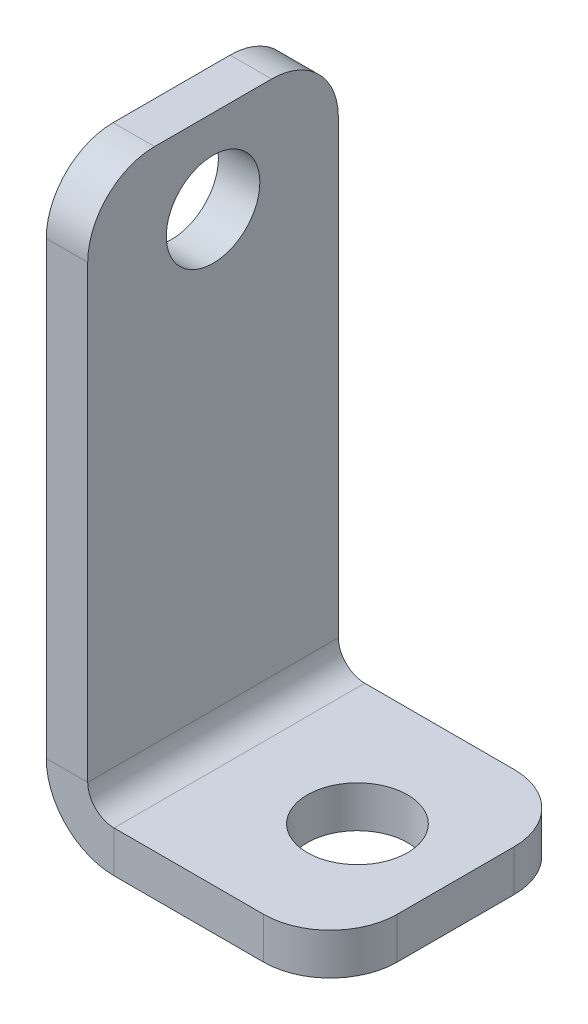
ISO-10303-21;
HEADER;
FILE_DESCRIPTION(('STEP AP214'),'2;1');
FILE_NAME('part.step','',(''),(''),'','','');
FILE_SCHEMA(('AUTOMOTIVE_DESIGN { 1 0 10303 214 1 1 1 1 }'));
ENDSEC;
DATA;
#1=APPLICATION_CONTEXT('core data for automotive mechanical design processes');
#2=APPLICATION_PROTOCOL_DEFINITION('international standard','automotive_design',2000,#1);
#3=PRODUCT_CONTEXT('',#1,'mechanical');
#4=PRODUCT('Part','Part','',(#3));
#5=PRODUCT_RELATED_PRODUCT_CATEGORY('part','',(#4));
#6=PRODUCT_DEFINITION_FORMATION('','',#4);
#7=PRODUCT_DEFINITION_CONTEXT('part definition',#1,'design');
#8=PRODUCT_DEFINITION('design','',#6,#7);
#9=PRODUCT_DEFINITION_SHAPE('','',#8);
#10=(LENGTH_UNIT() NAMED_UNIT(*) SI_UNIT(.MILLI.,.METRE.));
#11=(NAMED_UNIT(*) PLANE_ANGLE_UNIT() SI_UNIT($,.RADIAN.));
#12=(NAMED_UNIT(*) SI_UNIT($,.STERADIAN.) SOLID_ANGLE_UNIT());
#13=UNCERTAINTY_MEASURE_WITH_UNIT(LENGTH_MEASURE(1.E-05),#10,'distance_accuracy_value','');
#14=(GEOMETRIC_REPRESENTATION_CONTEXT(3) GLOBAL_UNCERTAINTY_ASSIGNED_CONTEXT((#13)) GLOBAL_UNIT_ASSIGNED_CONTEXT((#10,
#11,#12)) REPRESENTATION_CONTEXT('',''));
#15=CARTESIAN_POINT('',(0.,0.,0.));
#16=DIRECTION('',(0.,0.,1.));
#17=DIRECTION('',(1.,0.,0.));
#18=AXIS2_PLACEMENT_3D('',#15,#16,#17);
#19=CARTESIAN_POINT('',(0.,2.5748,9.525));
#20=DIRECTION('',(0.,0.,1.));
#21=DIRECTION('',(1.,0.,0.));
#22=AXIS2_PLACEMENT_3D('',#19,#20,#21);
#23=PLANE('',#22);
#24=DIRECTION('',(1.,0.,0.));
#25=VECTOR('',#24,1.);
#26=CARTESIAN_POINT('',(0.,2.5748,9.525));
#27=LINE('',#26,#25);
#28=CARTESIAN_POINT('',(0.,2.5748,9.525));
#29=VERTEX_POINT('',#28);
#30=CARTESIAN_POINT('',(1.5748,2.5748,9.525));
#31=VERTEX_POINT('',#30);
#32=EDGE_CURVE('E125',#29,#31,#27,.T.);
#33=ORIENTED_EDGE('',*,*,#32,.F.);
#34=CARTESIAN_POINT('',(2.5748,2.5748,9.525));
#35=DIRECTION('',(0.,0.,1.));
#36=DIRECTION('',(1.,0.,0.));
#37=AXIS2_PLACEMENT_3D('',#34,#35,#36);
#38=CIRCLE('',#37,2.5748);
#39=CARTESIAN_POINT('',(2.5748,0.,9.525));
#40=VERTEX_POINT('',#39);
#41=EDGE_CURVE('E129',#40,#29,#38,.F.);
#42=ORIENTED_EDGE('',*,*,#41,.F.);
#43=DIRECTION('',(0.,-1.,0.));
#44=VECTOR('',#43,1.);
#45=CARTESIAN_POINT('',(2.5748,1.5748,9.525));
#46=LINE('',#45,#44);
#47=CARTESIAN_POINT('',(2.5748,1.5748,9.525));
#48=VERTEX_POINT('',#47);
#49=EDGE_CURVE('E134',#48,#40,#46,.T.);
#50=ORIENTED_EDGE('',*,*,#49,.F.);
#51=CARTESIAN_POINT('',(2.5748,2.5748,9.525));
#52=DIRECTION('',(0.,0.,1.));
#53=DIRECTION('',(1.,0.,0.));
#54=AXIS2_PLACEMENT_3D('',#51,#52,#53);
#55=CIRCLE('',#54,1.);
#56=EDGE_CURVE('E131',#48,#31,#55,.F.);
#57=ORIENTED_EDGE('',*,*,#56,.T.);
#58=EDGE_LOOP('',(#33,#42,#50,#57));
#59=FACE_BOUND('',#58,.T.);
#60=ADVANCED_FACE('F34',(#59),#23,.T.);
#61=CARTESIAN_POINT('',(2.5748,1.5748,9.525));
#62=DIRECTION('',(0.,0.,1.));
#63=DIRECTION('',(1.,0.,0.));
#64=AXIS2_PLACEMENT_3D('',#61,#62,#63);
#65=PLANE('',#64);
#66=DIRECTION('',(0.,1.,0.));
#67=VECTOR('',#66,1.);
#68=CARTESIAN_POINT('',(1.5748,0.,9.525));
#69=LINE('',#68,#67);
#70=CARTESIAN_POINT('',(1.5748,19.685,9.525));
#71=VERTEX_POINT('',#70);
#72=EDGE_CURVE('E152',#31,#71,#69,.T.);
#73=ORIENTED_EDGE('',*,*,#72,.T.);
#74=DIRECTION('',(1.,0.,0.));
#75=VECTOR('',#74,1.);
#76=CARTESIAN_POINT('',(2.5748,19.685,9.525));
#77=LINE('',#76,#75);
#78=CARTESIAN_POINT('',(0.,19.685,9.525));
#79=VERTEX_POINT('',#78);
#80=EDGE_CURVE('E11',#71,#79,#77,.F.);
#81=ORIENTED_EDGE('',*,*,#80,.T.);
#82=DIRECTION('',(0.,1.,0.));
#83=VECTOR('',#82,1.);
#84=CARTESIAN_POINT('',(0.,0.,9.525));
#85=LINE('',#84,#83);
#86=EDGE_CURVE('E141',#29,#79,#85,.T.);
#87=ORIENTED_EDGE('',*,*,#86,.F.);
#88=ORIENTED_EDGE('',*,*,#32,.T.);
#89=EDGE_LOOP('',(#73,#81,#87,#88));
#90=FACE_BOUND('',#89,.T.);
#91=ADVANCED_FACE('F151',(#90),#65,.T.);
#92=CARTESIAN_POINT('',(2.5748,0.,0.));
#93=DIRECTION('',(0.,0.,-1.));
#94=DIRECTION('',(-1.,0.,0.));
#95=AXIS2_PLACEMENT_3D('',#92,#93,#94);
#96=PLANE('',#95);
#97=DIRECTION('',(0.,1.,0.));
#98=VECTOR('',#97,1.);
#99=CARTESIAN_POINT('',(2.5748,0.,0.));
#100=LINE('',#99,#98);
#101=CARTESIAN_POINT('',(2.5748,0.,0.));
#102=VERTEX_POINT('',#101);
#103=CARTESIAN_POINT('',(2.5748,1.5748,0.));
#104=VERTEX_POINT('',#103);
#105=EDGE_CURVE('E197',#102,#104,#100,.T.);
#106=ORIENTED_EDGE('',*,*,#105,.F.);
#107=CARTESIAN_POINT('',(2.5748,2.5748,0.));
#108=DIRECTION('',(0.,0.,1.));
#109=DIRECTION('',(1.,0.,0.));
#110=AXIS2_PLACEMENT_3D('',#107,#108,#109);
#111=CIRCLE('',#110,2.5748);
#112=CARTESIAN_POINT('',(0.,2.5748,0.));
#113=VERTEX_POINT('',#112);
#114=EDGE_CURVE('E171',#102,#113,#111,.F.);
#115=ORIENTED_EDGE('',*,*,#114,.T.);
#116=DIRECTION('',(-1.,0.,0.));
#117=VECTOR('',#116,1.);
#118=CARTESIAN_POINT('',(1.5748,2.5748,0.));
#119=LINE('',#118,#117);
#120=CARTESIAN_POINT('',(1.5748,2.5748,0.));
#121=VERTEX_POINT('',#120);
#122=EDGE_CURVE('E195',#121,#113,#119,.T.);
#123=ORIENTED_EDGE('',*,*,#122,.F.);
#124=CARTESIAN_POINT('',(2.5748,2.5748,0.));
#125=DIRECTION('',(0.,0.,1.));
#126=DIRECTION('',(1.,0.,0.));
#127=AXIS2_PLACEMENT_3D('',#124,#125,#126);
#128=CIRCLE('',#127,1.);
#129=EDGE_CURVE('E177',#104,#121,#128,.F.);
#130=ORIENTED_EDGE('',*,*,#129,.F.);
#131=EDGE_LOOP('',(#106,#115,#123,#130));
#132=FACE_BOUND('',#131,.T.);
#133=ADVANCED_FACE('F275',(#132),#96,.T.);
#134=CARTESIAN_POINT('',(1.5748,2.5748,0.));
#135=DIRECTION('',(0.,0.,-1.));
#136=DIRECTION('',(-1.,0.,0.));
#137=AXIS2_PLACEMENT_3D('',#134,#135,#136);
#138=PLANE('',#137);
#139=DIRECTION('',(1.,0.,0.));
#140=VECTOR('',#139,1.);
#141=CARTESIAN_POINT('',(0.,1.5748,0.));
#142=LINE('',#141,#140);
#143=CARTESIAN_POINT('',(8.255,1.5748,0.));
#144=VERTEX_POINT('',#143);
#145=EDGE_CURVE('E175',#144,#104,#142,.F.);
#146=ORIENTED_EDGE('',*,*,#145,.F.);
#147=DIRECTION('',(0.,-1.,0.));
#148=VECTOR('',#147,1.);
#149=CARTESIAN_POINT('',(8.255,2.5748,0.));
#150=LINE('',#149,#148);
#151=CARTESIAN_POINT('',(8.255,0.,0.));
#152=VERTEX_POINT('',#151);
#153=EDGE_CURVE('E216',#144,#152,#150,.T.);
#154=ORIENTED_EDGE('',*,*,#153,.T.);
#155=DIRECTION('',(-1.,0.,0.));
#156=VECTOR('',#155,1.);
#157=CARTESIAN_POINT('',(0.,0.,0.));
#158=LINE('',#157,#156);
#159=EDGE_CURVE('E173',#152,#102,#158,.T.);
#160=ORIENTED_EDGE('',*,*,#159,.T.);
#161=ORIENTED_EDGE('',*,*,#105,.T.);
#162=EDGE_LOOP('',(#146,#154,#160,#161));
#163=FACE_BOUND('',#162,.T.);
#164=ADVANCED_FACE('F268',(#163),#138,.T.);
#165=CARTESIAN_POINT('',(1.5748,0.,9.525));
#166=DIRECTION('',(-1.,0.,0.));
#167=DIRECTION('',(0.,0.,1.));
#168=AXIS2_PLACEMENT_3D('',#165,#166,#167);
#169=PLANE('',#168);
#170=CARTESIAN_POINT('',(1.5748,19.05,4.7625));
#171=DIRECTION('',(1.,0.,0.));
#172=DIRECTION('',(0.,0.,-1.));
#173=AXIS2_PLACEMENT_3D('',#170,#171,#172);
#174=CIRCLE('',#173,1.778);
#175=CARTESIAN_POINT('',(1.5748,19.05,2.9845));
#176=VERTEX_POINT('',#175);
#177=EDGE_CURVE('E252',#176,#176,#174,.T.);
#178=ORIENTED_EDGE('',*,*,#177,.F.);
#179=EDGE_LOOP('',(#178));
#180=FACE_BOUND('',#179,.T.);
#181=DIRECTION('',(0.,1.,0.));
#182=VECTOR('',#181,1.);
#183=CARTESIAN_POINT('',(1.5748,0.,0.));
#184=LINE('',#183,#182);
#185=CARTESIAN_POINT('',(1.5748,19.685,0.));
#186=VERTEX_POINT('',#185);
#187=EDGE_CURVE('E166',#121,#186,#184,.T.);
#188=ORIENTED_EDGE('',*,*,#187,.T.);
#189=CARTESIAN_POINT('',(1.5748,19.685,2.54));
#190=DIRECTION('',(-1.,0.,0.));
#191=DIRECTION('',(0.,0.,1.));
#192=AXIS2_PLACEMENT_3D('',#189,#190,#191);
#193=CIRCLE('',#192,2.54);
#194=CARTESIAN_POINT('',(1.5748,22.225,2.54));
#195=VERTEX_POINT('',#194);
#196=EDGE_CURVE('E224',#186,#195,#193,.F.);
#197=ORIENTED_EDGE('',*,*,#196,.T.);
#198=DIRECTION('',(0.,0.,-1.));
#199=VECTOR('',#198,1.);
#200=CARTESIAN_POINT('',(1.5748,22.225,9.525));
#201=LINE('',#200,#199);
#202=CARTESIAN_POINT('',(1.5748,22.225,6.985));
#203=VERTEX_POINT('',#202);
#204=EDGE_CURVE('E193',#203,#195,#201,.T.);
#205=ORIENTED_EDGE('',*,*,#204,.F.);
#206=CARTESIAN_POINT('',(1.5748,19.685,6.985));
#207=DIRECTION('',(-1.,0.,0.));
#208=DIRECTION('',(0.,0.,1.));
#209=AXIS2_PLACEMENT_3D('',#206,#207,#208);
#210=CIRCLE('',#209,2.54);
#211=EDGE_CURVE('E222',#203,#71,#210,.F.);
#212=ORIENTED_EDGE('',*,*,#211,.T.);
#213=ORIENTED_EDGE('',*,*,#72,.F.);
#214=DIRECTION('',(0.,0.,-1.));
#215=VECTOR('',#214,1.);
#216=CARTESIAN_POINT('',(1.5748,2.5748,9.525));
#217=LINE('',#216,#215);
#218=EDGE_CURVE('E165',#31,#121,#217,.T.);
#219=ORIENTED_EDGE('',*,*,#218,.T.);
#220=EDGE_LOOP('',(#188,#197,#205,#212,#213,#219));
#221=FACE_BOUND('',#220,.T.);
#222=ADVANCED_FACE('F240',(#180,#221),#169,.F.);
#223=CARTESIAN_POINT('',(0.,22.225,9.525));
#224=DIRECTION('',(0.,1.,0.));
#225=DIRECTION('',(0.,0.,1.));
#226=AXIS2_PLACEMENT_3D('',#223,#224,#225);
#227=PLANE('',#226);
#228=ORIENTED_EDGE('',*,*,#204,.T.);
#229=DIRECTION('',(1.,0.,0.));
#230=VECTOR('',#229,1.);
#231=CARTESIAN_POINT('',(0.,22.225,2.54));
#232=LINE('',#231,#230);
#233=CARTESIAN_POINT('',(0.,22.225,2.54));
#234=VERTEX_POINT('',#233);
#235=EDGE_CURVE('E55',#195,#234,#232,.F.);
#236=ORIENTED_EDGE('',*,*,#235,.T.);
#237=DIRECTION('',(0.,0.,-1.));
#238=VECTOR('',#237,1.);
#239=CARTESIAN_POINT('',(0.,22.225,9.525));
#240=LINE('',#239,#238);
#241=CARTESIAN_POINT('',(0.,22.225,6.985));
#242=VERTEX_POINT('',#241);
#243=EDGE_CURVE('E148',#242,#234,#240,.T.);
#244=ORIENTED_EDGE('',*,*,#243,.F.);
#245=DIRECTION('',(1.,0.,0.));
#246=VECTOR('',#245,1.);
#247=CARTESIAN_POINT('',(0.,22.225,6.985));
#248=LINE('',#247,#246);
#249=EDGE_CURVE('E226',#242,#203,#248,.T.);
#250=ORIENTED_EDGE('',*,*,#249,.T.);
#251=EDGE_LOOP('',(#228,#236,#244,#250));
#252=FACE_BOUND('',#251,.T.);
#253=ADVANCED_FACE('F241',(#252),#227,.T.);
#254=CARTESIAN_POINT('',(0.,0.,9.525));
#255=DIRECTION('',(-1.,0.,0.));
#256=DIRECTION('',(0.,0.,1.));
#257=AXIS2_PLACEMENT_3D('',#254,#255,#256);
#258=PLANE('',#257);
#259=CARTESIAN_POINT('',(0.,19.05,4.7625));
#260=DIRECTION('',(1.,0.,0.));
#261=DIRECTION('',(0.,0.,-1.));
#262=AXIS2_PLACEMENT_3D('',#259,#260,#261);
#263=CIRCLE('',#262,1.778);
#264=CARTESIAN_POINT('',(0.,19.05,2.9845));
#265=VERTEX_POINT('',#264);
#266=EDGE_CURVE('E249',#265,#265,#263,.T.);
#267=ORIENTED_EDGE('',*,*,#266,.T.);
#268=EDGE_LOOP('',(#267));
#269=FACE_BOUND('',#268,.T.);
#270=ORIENTED_EDGE('',*,*,#243,.T.);
#271=CARTESIAN_POINT('',(0.,19.685,2.54));
#272=DIRECTION('',(-1.,0.,0.));
#273=DIRECTION('',(0.,0.,1.));
#274=AXIS2_PLACEMENT_3D('',#271,#272,#273);
#275=CIRCLE('',#274,2.54);
#276=CARTESIAN_POINT('',(0.,19.685,0.));
#277=VERTEX_POINT('',#276);
#278=EDGE_CURVE('E42',#234,#277,#275,.T.);
#279=ORIENTED_EDGE('',*,*,#278,.T.);
#280=DIRECTION('',(0.,1.,0.));
#281=VECTOR('',#280,1.);
#282=CARTESIAN_POINT('',(0.,0.,0.));
#283=LINE('',#282,#281);
#284=EDGE_CURVE('E144',#113,#277,#283,.T.);
#285=ORIENTED_EDGE('',*,*,#284,.F.);
#286=DIRECTION('',(0.,0.,-1.));
#287=VECTOR('',#286,1.);
#288=CARTESIAN_POINT('',(0.,2.5748,9.525));
#289=LINE('',#288,#287);
#290=EDGE_CURVE('E139',#29,#113,#289,.T.);
#291=ORIENTED_EDGE('',*,*,#290,.F.);
#292=ORIENTED_EDGE('',*,*,#86,.T.);
#293=CARTESIAN_POINT('',(0.,19.685,6.985));
#294=DIRECTION('',(-1.,0.,0.));
#295=DIRECTION('',(0.,0.,1.));
#296=AXIS2_PLACEMENT_3D('',#293,#294,#295);
#297=CIRCLE('',#296,2.54);
#298=EDGE_CURVE('E230',#79,#242,#297,.T.);
#299=ORIENTED_EDGE('',*,*,#298,.T.);
#300=EDGE_LOOP('',(#270,#279,#285,#291,#292,#299));
#301=FACE_BOUND('',#300,.T.);
#302=ADVANCED_FACE('F140',(#269,#301),#258,.T.);
#303=CARTESIAN_POINT('',(2.5748,2.5748,9.525));
#304=DIRECTION('',(0.,0.,-1.));
#305=DIRECTION('',(-1.,0.,0.));
#306=AXIS2_PLACEMENT_3D('',#303,#304,#305);
#307=CYLINDRICAL_SURFACE('',#306,2.5748);
#308=ORIENTED_EDGE('',*,*,#114,.F.);
#309=DIRECTION('',(0.,0.,-1.));
#310=VECTOR('',#309,1.);
#311=CARTESIAN_POINT('',(2.5748,0.,9.525));
#312=LINE('',#311,#310);
#313=EDGE_CURVE('E149',#40,#102,#312,.T.);
#314=ORIENTED_EDGE('',*,*,#313,.F.);
#315=ORIENTED_EDGE('',*,*,#41,.T.);
#316=ORIENTED_EDGE('',*,*,#290,.T.);
#317=EDGE_LOOP('',(#308,#314,#315,#316));
#318=FACE_BOUND('',#317,.T.);
#319=ADVANCED_FACE('F155',(#318),#307,.T.);
#320=CARTESIAN_POINT('',(0.,0.,9.525));
#321=DIRECTION('',(0.,-1.,0.));
#322=DIRECTION('',(0.,0.,-1.));
#323=AXIS2_PLACEMENT_3D('',#320,#321,#322);
#324=PLANE('',#323);
#325=CARTESIAN_POINT('',(7.0612,0.,4.7625));
#326=DIRECTION('',(0.,1.,0.));
#327=DIRECTION('',(0.,0.,1.));
#328=AXIS2_PLACEMENT_3D('',#325,#326,#327);
#329=CIRCLE('',#328,1.905);
#330=CARTESIAN_POINT('',(7.0612,0.,6.6675));
#331=VERTEX_POINT('',#330);
#332=EDGE_CURVE('E169',#331,#331,#329,.T.);
#333=ORIENTED_EDGE('',*,*,#332,.T.);
#334=EDGE_LOOP('',(#333));
#335=FACE_BOUND('',#334,.T.);
#336=DIRECTION('',(0.,0.,-1.));
#337=VECTOR('',#336,1.);
#338=CARTESIAN_POINT('',(10.795,0.,9.525));
#339=LINE('',#338,#337);
#340=CARTESIAN_POINT('',(10.795,0.,6.985));
#341=VERTEX_POINT('',#340);
#342=CARTESIAN_POINT('',(10.795,0.,2.54));
#343=VERTEX_POINT('',#342);
#344=EDGE_CURVE('E188',#341,#343,#339,.T.);
#345=ORIENTED_EDGE('',*,*,#344,.F.);
#346=CARTESIAN_POINT('',(8.255,0.,6.985));
#347=DIRECTION('',(0.,-1.,0.));
#348=DIRECTION('',(0.,0.,-1.));
#349=AXIS2_PLACEMENT_3D('',#346,#347,#348);
#350=CIRCLE('',#349,2.54);
#351=CARTESIAN_POINT('',(8.255,0.,9.525));
#352=VERTEX_POINT('',#351);
#353=EDGE_CURVE('E208',#341,#352,#350,.T.);
#354=ORIENTED_EDGE('',*,*,#353,.T.);
#355=DIRECTION('',(-1.,0.,0.));
#356=VECTOR('',#355,1.);
#357=CARTESIAN_POINT('',(0.,0.,9.525));
#358=LINE('',#357,#356);
#359=EDGE_CURVE('E157',#352,#40,#358,.T.);
#360=ORIENTED_EDGE('',*,*,#359,.T.);
#361=ORIENTED_EDGE('',*,*,#313,.T.);
#362=ORIENTED_EDGE('',*,*,#159,.F.);
#363=CARTESIAN_POINT('',(8.255,0.,2.54));
#364=DIRECTION('',(0.,-1.,0.));
#365=DIRECTION('',(0.,0.,-1.));
#366=AXIS2_PLACEMENT_3D('',#363,#364,#365);
#367=CIRCLE('',#366,2.54);
#368=EDGE_CURVE('E206',#152,#343,#367,.T.);
#369=ORIENTED_EDGE('',*,*,#368,.T.);
#370=EDGE_LOOP('',(#345,#354,#360,#361,#362,#369));
#371=FACE_BOUND('',#370,.T.);
#372=ADVANCED_FACE('F361',(#335,#371),#324,.T.);
#373=CARTESIAN_POINT('',(10.795,1.5748,9.525));
#374=DIRECTION('',(1.,0.,0.));
#375=DIRECTION('',(0.,0.,-1.));
#376=AXIS2_PLACEMENT_3D('',#373,#374,#375);
#377=PLANE('',#376);
#378=DIRECTION('',(0.,0.,-1.));
#379=VECTOR('',#378,1.);
#380=CARTESIAN_POINT('',(10.795,1.5748,9.525));
#381=LINE('',#380,#379);
#382=CARTESIAN_POINT('',(10.795,1.5748,6.985));
#383=VERTEX_POINT('',#382);
#384=CARTESIAN_POINT('',(10.795,1.5748,2.54));
#385=VERTEX_POINT('',#384);
#386=EDGE_CURVE('E185',#383,#385,#381,.T.);
#387=ORIENTED_EDGE('',*,*,#386,.F.);
#388=DIRECTION('',(0.,-1.,0.));
#389=VECTOR('',#388,1.);
#390=CARTESIAN_POINT('',(10.795,1.5748,6.985));
#391=LINE('',#390,#389);
#392=EDGE_CURVE('E203',#383,#341,#391,.T.);
#393=ORIENTED_EDGE('',*,*,#392,.T.);
#394=ORIENTED_EDGE('',*,*,#344,.T.);
#395=DIRECTION('',(0.,-1.,0.));
#396=VECTOR('',#395,1.);
#397=CARTESIAN_POINT('',(10.795,1.5748,2.54));
#398=LINE('',#397,#396);
#399=EDGE_CURVE('E133',#343,#385,#398,.F.);
#400=ORIENTED_EDGE('',*,*,#399,.T.);
#401=EDGE_LOOP('',(#387,#393,#394,#400));
#402=FACE_BOUND('',#401,.T.);
#403=ADVANCED_FACE('F350',(#402),#377,.T.);
#404=CARTESIAN_POINT('',(0.,1.5748,9.525));
#405=DIRECTION('',(0.,-1.,0.));
#406=DIRECTION('',(0.,0.,-1.));
#407=AXIS2_PLACEMENT_3D('',#404,#405,#406);
#408=PLANE('',#407);
#409=CARTESIAN_POINT('',(7.0612,1.5748,4.7625));
#410=DIRECTION('',(0.,1.,0.));
#411=DIRECTION('',(0.,0.,1.));
#412=AXIS2_PLACEMENT_3D('',#409,#410,#411);
#413=CIRCLE('',#412,1.905);
#414=CARTESIAN_POINT('',(7.0612,1.5748,6.6675));
#415=VERTEX_POINT('',#414);
#416=EDGE_CURVE('E246',#415,#415,#413,.T.);
#417=ORIENTED_EDGE('',*,*,#416,.F.);
#418=EDGE_LOOP('',(#417));
#419=FACE_BOUND('',#418,.T.);
#420=DIRECTION('',(1.,0.,0.));
#421=VECTOR('',#420,1.);
#422=CARTESIAN_POINT('',(0.,1.5748,9.525));
#423=LINE('',#422,#421);
#424=CARTESIAN_POINT('',(8.255,1.5748,9.525));
#425=VERTEX_POINT('',#424);
#426=EDGE_CURVE('E159',#425,#48,#423,.F.);
#427=ORIENTED_EDGE('',*,*,#426,.F.);
#428=CARTESIAN_POINT('',(8.255,1.5748,6.985));
#429=DIRECTION('',(0.,-1.,0.));
#430=DIRECTION('',(0.,0.,-1.));
#431=AXIS2_PLACEMENT_3D('',#428,#429,#430);
#432=CIRCLE('',#431,2.54);
#433=EDGE_CURVE('E214',#425,#383,#432,.F.);
#434=ORIENTED_EDGE('',*,*,#433,.T.);
#435=ORIENTED_EDGE('',*,*,#386,.T.);
#436=CARTESIAN_POINT('',(8.255,1.5748,2.54));
#437=DIRECTION('',(0.,-1.,0.));
#438=DIRECTION('',(0.,0.,-1.));
#439=AXIS2_PLACEMENT_3D('',#436,#437,#438);
#440=CIRCLE('',#439,2.54);
#441=EDGE_CURVE('E212',#385,#144,#440,.F.);
#442=ORIENTED_EDGE('',*,*,#441,.T.);
#443=ORIENTED_EDGE('',*,*,#145,.T.);
#444=DIRECTION('',(0.,0.,-1.));
#445=VECTOR('',#444,1.);
#446=CARTESIAN_POINT('',(2.5748,1.5748,9.525));
#447=LINE('',#446,#445);
#448=EDGE_CURVE('E182',#48,#104,#447,.T.);
#449=ORIENTED_EDGE('',*,*,#448,.F.);
#450=EDGE_LOOP('',(#427,#434,#435,#442,#443,#449));
#451=FACE_BOUND('',#450,.T.);
#452=ADVANCED_FACE('F345',(#419,#451),#408,.F.);
#453=CARTESIAN_POINT('',(2.5748,2.5748,9.525));
#454=DIRECTION('',(0.,0.,-1.));
#455=DIRECTION('',(-1.,0.,0.));
#456=AXIS2_PLACEMENT_3D('',#453,#454,#455);
#457=CYLINDRICAL_SURFACE('',#456,1.);
#458=ORIENTED_EDGE('',*,*,#129,.T.);
#459=ORIENTED_EDGE('',*,*,#218,.F.);
#460=ORIENTED_EDGE('',*,*,#56,.F.);
#461=ORIENTED_EDGE('',*,*,#448,.T.);
#462=EDGE_LOOP('',(#458,#459,#460,#461));
#463=FACE_BOUND('',#462,.T.);
#464=ADVANCED_FACE('F336',(#463),#457,.F.);
#465=CARTESIAN_POINT('',(2.5748,2.5748,9.525));
#466=DIRECTION('',(0.,0.,1.));
#467=DIRECTION('',(1.,0.,0.));
#468=AXIS2_PLACEMENT_3D('',#465,#466,#467);
#469=PLANE('',#468);
#470=ORIENTED_EDGE('',*,*,#359,.F.);
#471=DIRECTION('',(0.,-1.,0.));
#472=VECTOR('',#471,1.);
#473=CARTESIAN_POINT('',(8.255,2.5748,9.525));
#474=LINE('',#473,#472);
#475=EDGE_CURVE('E210',#352,#425,#474,.F.);
#476=ORIENTED_EDGE('',*,*,#475,.T.);
#477=ORIENTED_EDGE('',*,*,#426,.T.);
#478=ORIENTED_EDGE('',*,*,#49,.T.);
#479=EDGE_LOOP('',(#470,#476,#477,#478));
#480=FACE_BOUND('',#479,.T.);
#481=ADVANCED_FACE('F324',(#480),#469,.T.);
#482=CARTESIAN_POINT('',(2.5748,2.5748,0.));
#483=DIRECTION('',(0.,0.,1.));
#484=DIRECTION('',(1.,0.,0.));
#485=AXIS2_PLACEMENT_3D('',#482,#483,#484);
#486=PLANE('',#485);
#487=ORIENTED_EDGE('',*,*,#284,.T.);
#488=DIRECTION('',(1.,0.,0.));
#489=VECTOR('',#488,1.);
#490=CARTESIAN_POINT('',(1.5748,19.685,0.));
#491=LINE('',#490,#489);
#492=EDGE_CURVE('E219',#277,#186,#491,.T.);
#493=ORIENTED_EDGE('',*,*,#492,.T.);
#494=ORIENTED_EDGE('',*,*,#187,.F.);
#495=ORIENTED_EDGE('',*,*,#122,.T.);
#496=EDGE_LOOP('',(#487,#493,#494,#495));
#497=FACE_BOUND('',#496,.T.);
#498=ADVANCED_FACE('F235',(#497),#486,.F.);
#499=CARTESIAN_POINT('',(7.0612,0.,4.7625));
#500=DIRECTION('',(0.,1.,0.));
#501=DIRECTION('',(0.,0.,1.));
#502=AXIS2_PLACEMENT_3D('',#499,#500,#501);
#503=CYLINDRICAL_SURFACE('',#502,1.905);
#504=ORIENTED_EDGE('',*,*,#332,.F.);
#505=EDGE_LOOP('',(#504));
#506=FACE_BOUND('',#505,.T.);
#507=ORIENTED_EDGE('',*,*,#416,.T.);
#508=EDGE_LOOP('',(#507));
#509=FACE_BOUND('',#508,.T.);
#510=ADVANCED_FACE('F263',(#506,#509),#503,.F.);
#511=CARTESIAN_POINT('',(0.,19.05,4.7625));
#512=DIRECTION('',(1.,0.,0.));
#513=DIRECTION('',(0.,0.,-1.));
#514=AXIS2_PLACEMENT_3D('',#511,#512,#513);
#515=CYLINDRICAL_SURFACE('',#514,1.778);
#516=ORIENTED_EDGE('',*,*,#266,.F.);
#517=EDGE_LOOP('',(#516));
#518=FACE_BOUND('',#517,.T.);
#519=ORIENTED_EDGE('',*,*,#177,.T.);
#520=EDGE_LOOP('',(#519));
#521=FACE_BOUND('',#520,.T.);
#522=ADVANCED_FACE('F259',(#518,#521),#515,.F.);
#523=CARTESIAN_POINT('',(8.255,1.5748,6.985));
#524=DIRECTION('',(0.,-1.,0.));
#525=DIRECTION('',(0.,0.,-1.));
#526=AXIS2_PLACEMENT_3D('',#523,#524,#525);
#527=CYLINDRICAL_SURFACE('',#526,2.54);
#528=ORIENTED_EDGE('',*,*,#433,.F.);
#529=ORIENTED_EDGE('',*,*,#475,.F.);
#530=ORIENTED_EDGE('',*,*,#353,.F.);
#531=ORIENTED_EDGE('',*,*,#392,.F.);
#532=EDGE_LOOP('',(#528,#529,#530,#531));
#533=FACE_BOUND('',#532,.T.);
#534=ADVANCED_FACE('F262',(#533),#527,.T.);
#535=CARTESIAN_POINT('',(8.255,2.5748,2.54));
#536=DIRECTION('',(0.,-1.,0.));
#537=DIRECTION('',(0.,0.,-1.));
#538=AXIS2_PLACEMENT_3D('',#535,#536,#537);
#539=CYLINDRICAL_SURFACE('',#538,2.54);
#540=ORIENTED_EDGE('',*,*,#441,.F.);
#541=ORIENTED_EDGE('',*,*,#399,.F.);
#542=ORIENTED_EDGE('',*,*,#368,.F.);
#543=ORIENTED_EDGE('',*,*,#153,.F.);
#544=EDGE_LOOP('',(#540,#541,#542,#543));
#545=FACE_BOUND('',#544,.T.);
#546=ADVANCED_FACE('F288',(#545),#539,.T.);
#547=CARTESIAN_POINT('',(2.5748,19.685,2.54));
#548=DIRECTION('',(-1.,0.,0.));
#549=DIRECTION('',(0.,0.,1.));
#550=AXIS2_PLACEMENT_3D('',#547,#548,#549);
#551=CYLINDRICAL_SURFACE('',#550,2.54);
#552=ORIENTED_EDGE('',*,*,#278,.F.);
#553=ORIENTED_EDGE('',*,*,#235,.F.);
#554=ORIENTED_EDGE('',*,*,#196,.F.);
#555=ORIENTED_EDGE('',*,*,#492,.F.);
#556=EDGE_LOOP('',(#552,#553,#554,#555));
#557=FACE_BOUND('',#556,.T.);
#558=ADVANCED_FACE('F237',(#557),#551,.T.);
#559=CARTESIAN_POINT('',(0.,19.685,6.985));
#560=DIRECTION('',(1.,0.,0.));
#561=DIRECTION('',(0.,0.,-1.));
#562=AXIS2_PLACEMENT_3D('',#559,#560,#561);
#563=CYLINDRICAL_SURFACE('',#562,2.54);
#564=ORIENTED_EDGE('',*,*,#298,.F.);
#565=ORIENTED_EDGE('',*,*,#80,.F.);
#566=ORIENTED_EDGE('',*,*,#211,.F.);
#567=ORIENTED_EDGE('',*,*,#249,.F.);
#568=EDGE_LOOP('',(#564,#565,#566,#567));
#569=FACE_BOUND('',#568,.T.);
#570=ADVANCED_FACE('F36',(#569),#563,.T.);
#571=CLOSED_SHELL('',(#60,#91,#133,#164,#222,#253,#302,#319,#372,#403,#452,#464,#481,#498,#510,
#522,#534,#546,#558,#570));
#572=MANIFOLD_SOLID_BREP('B2',#571);
#573=ADVANCED_BREP_SHAPE_REPRESENTATION('',(#18,#572),#14);
#574=SHAPE_DEFINITION_REPRESENTATION(#9,#573);
ENDSEC;
END-ISO-10303-21;
